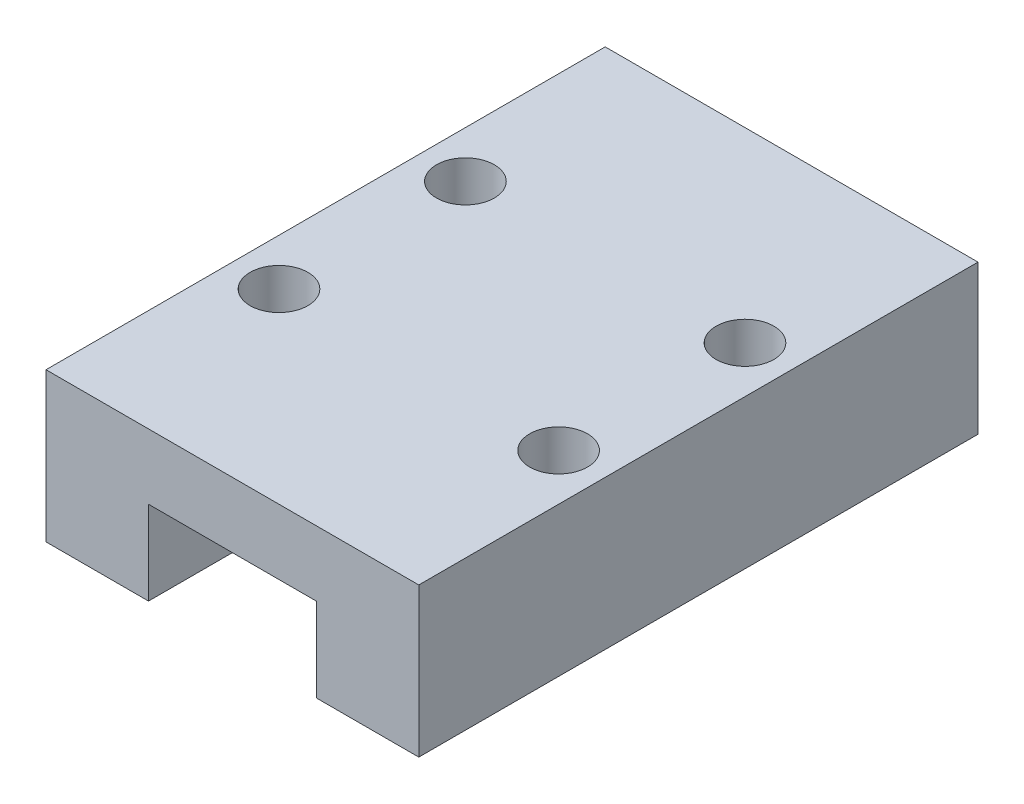
ISO-10303-21;
HEADER;
FILE_DESCRIPTION(('STEP AP214'),'2;1');
FILE_NAME('part.step','',(''),(''),'','','');
FILE_SCHEMA(('AUTOMOTIVE_DESIGN { 1 0 10303 214 1 1 1 1 }'));
ENDSEC;
DATA;
#1=APPLICATION_CONTEXT('core data for automotive mechanical design processes');
#2=APPLICATION_PROTOCOL_DEFINITION('international standard','automotive_design',2000,#1);
#3=PRODUCT_CONTEXT('',#1,'mechanical');
#4=PRODUCT('Part','Part','',(#3));
#5=PRODUCT_RELATED_PRODUCT_CATEGORY('part','',(#4));
#6=PRODUCT_DEFINITION_FORMATION('','',#4);
#7=PRODUCT_DEFINITION_CONTEXT('part definition',#1,'design');
#8=PRODUCT_DEFINITION('design','',#6,#7);
#9=PRODUCT_DEFINITION_SHAPE('','',#8);
#10=(LENGTH_UNIT() NAMED_UNIT(*) SI_UNIT(.MILLI.,.METRE.));
#11=(NAMED_UNIT(*) PLANE_ANGLE_UNIT() SI_UNIT($,.RADIAN.));
#12=(NAMED_UNIT(*) SI_UNIT($,.STERADIAN.) SOLID_ANGLE_UNIT());
#13=UNCERTAINTY_MEASURE_WITH_UNIT(LENGTH_MEASURE(1.E-05),#10,'distance_accuracy_value','');
#14=(GEOMETRIC_REPRESENTATION_CONTEXT(3) GLOBAL_UNCERTAINTY_ASSIGNED_CONTEXT((#13)) GLOBAL_UNIT_ASSIGNED_CONTEXT((#10,
#11,#12)) REPRESENTATION_CONTEXT('',''));
#15=CARTESIAN_POINT('',(0.,0.,0.));
#16=DIRECTION('',(0.,0.,1.));
#17=DIRECTION('',(1.,0.,0.));
#18=AXIS2_PLACEMENT_3D('',#15,#16,#17);
#19=CARTESIAN_POINT('',(0.,0.,0.));
#20=DIRECTION('',(0.,1.,0.));
#21=DIRECTION('',(0.,0.,1.));
#22=AXIS2_PLACEMENT_3D('',#19,#20,#21);
#23=PLANE('',#22);
#24=DIRECTION('',(0.,0.,1.));
#25=VECTOR('',#24,1.);
#26=CARTESIAN_POINT('',(-4.5,0.,-15.));
#27=LINE('',#26,#25);
#28=CARTESIAN_POINT('',(-4.5,0.,-15.));
#29=VERTEX_POINT('',#28);
#30=CARTESIAN_POINT('',(-4.49999999999999,0.,15.));
#31=VERTEX_POINT('',#30);
#32=EDGE_CURVE('E122',#29,#31,#27,.T.);
#33=ORIENTED_EDGE('',*,*,#32,.F.);
#34=DIRECTION('',(-1.,0.,0.));
#35=VECTOR('',#34,1.);
#36=CARTESIAN_POINT('',(-10.,0.,-15.));
#37=LINE('',#36,#35);
#38=CARTESIAN_POINT('',(4.5,0.,-15.));
#39=VERTEX_POINT('',#38);
#40=EDGE_CURVE('E153',#39,#29,#37,.T.);
#41=ORIENTED_EDGE('',*,*,#40,.F.);
#42=DIRECTION('',(0.,0.,-1.));
#43=VECTOR('',#42,1.);
#44=CARTESIAN_POINT('',(4.5,0.,-15.));
#45=LINE('',#44,#43);
#46=CARTESIAN_POINT('',(4.5,0.,15.));
#47=VERTEX_POINT('',#46);
#48=EDGE_CURVE('E134',#47,#39,#45,.T.);
#49=ORIENTED_EDGE('',*,*,#48,.F.);
#50=DIRECTION('',(1.,0.,0.));
#51=VECTOR('',#50,1.);
#52=CARTESIAN_POINT('',(-10.,0.,15.));
#53=LINE('',#52,#51);
#54=EDGE_CURVE('E56',#31,#47,#53,.T.);
#55=ORIENTED_EDGE('',*,*,#54,.F.);
#56=EDGE_LOOP('',(#33,#41,#49,#55));
#57=FACE_BOUND('',#56,.T.);
#58=ADVANCED_FACE('F36',(#57),#23,.F.);
#59=CARTESIAN_POINT('',(10.,3.5,-15.));
#60=DIRECTION('',(-1.,0.,0.));
#61=DIRECTION('',(0.,0.,1.));
#62=AXIS2_PLACEMENT_3D('',#59,#60,#61);
#63=PLANE('',#62);
#64=DIRECTION('',(0.,-1.,0.));
#65=VECTOR('',#64,1.);
#66=CARTESIAN_POINT('',(10.,3.5,15.));
#67=LINE('',#66,#65);
#68=CARTESIAN_POINT('',(10.,3.5,15.));
#69=VERTEX_POINT('',#68);
#70=CARTESIAN_POINT('',(10.,-4.5,15.));
#71=VERTEX_POINT('',#70);
#72=EDGE_CURVE('E162',#69,#71,#67,.T.);
#73=ORIENTED_EDGE('',*,*,#72,.T.);
#74=DIRECTION('',(0.,0.,1.));
#75=VECTOR('',#74,1.);
#76=CARTESIAN_POINT('',(10.,-4.5,-15.));
#77=LINE('',#76,#75);
#78=CARTESIAN_POINT('',(10.,-4.5,-15.));
#79=VERTEX_POINT('',#78);
#80=EDGE_CURVE('E135',#79,#71,#77,.T.);
#81=ORIENTED_EDGE('',*,*,#80,.F.);
#82=DIRECTION('',(0.,-1.,0.));
#83=VECTOR('',#82,1.);
#84=CARTESIAN_POINT('',(10.,3.5,-15.));
#85=LINE('',#84,#83);
#86=CARTESIAN_POINT('',(10.,3.5,-15.));
#87=VERTEX_POINT('',#86);
#88=EDGE_CURVE('E11',#87,#79,#85,.T.);
#89=ORIENTED_EDGE('',*,*,#88,.F.);
#90=DIRECTION('',(0.,0.,-1.));
#91=VECTOR('',#90,1.);
#92=CARTESIAN_POINT('',(10.,3.5,-15.));
#93=LINE('',#92,#91);
#94=EDGE_CURVE('E154',#69,#87,#93,.T.);
#95=ORIENTED_EDGE('',*,*,#94,.F.);
#96=EDGE_LOOP('',(#73,#81,#89,#95));
#97=FACE_BOUND('',#96,.T.);
#98=ADVANCED_FACE('F38',(#97),#63,.F.);
#99=CARTESIAN_POINT('',(-10.,3.5,-15.));
#100=DIRECTION('',(0.,0.,1.));
#101=DIRECTION('',(1.,0.,0.));
#102=AXIS2_PLACEMENT_3D('',#99,#100,#101);
#103=PLANE('',#102);
#104=ORIENTED_EDGE('',*,*,#88,.T.);
#105=DIRECTION('',(1.,0.,0.));
#106=VECTOR('',#105,1.);
#107=CARTESIAN_POINT('',(10.,-4.5,-15.));
#108=LINE('',#107,#106);
#109=CARTESIAN_POINT('',(4.5,-4.5,-15.));
#110=VERTEX_POINT('',#109);
#111=EDGE_CURVE('E142',#110,#79,#108,.T.);
#112=ORIENTED_EDGE('',*,*,#111,.F.);
#113=DIRECTION('',(0.,1.,0.));
#114=VECTOR('',#113,1.);
#115=CARTESIAN_POINT('',(4.5,-4.5,-15.));
#116=LINE('',#115,#114);
#117=EDGE_CURVE('E145',#110,#39,#116,.T.);
#118=ORIENTED_EDGE('',*,*,#117,.T.);
#119=ORIENTED_EDGE('',*,*,#40,.T.);
#120=DIRECTION('',(0.,1.,0.));
#121=VECTOR('',#120,1.);
#122=CARTESIAN_POINT('',(-4.5,-4.5,-15.));
#123=LINE('',#122,#121);
#124=CARTESIAN_POINT('',(-4.5,-4.5,-15.));
#125=VERTEX_POINT('',#124);
#126=EDGE_CURVE('E114',#125,#29,#123,.T.);
#127=ORIENTED_EDGE('',*,*,#126,.F.);
#128=DIRECTION('',(1.,0.,0.));
#129=VECTOR('',#128,1.);
#130=CARTESIAN_POINT('',(-10.,-4.5,-15.));
#131=LINE('',#130,#129);
#132=CARTESIAN_POINT('',(-10.,-4.5,-15.));
#133=VERTEX_POINT('',#132);
#134=EDGE_CURVE('E111',#133,#125,#131,.T.);
#135=ORIENTED_EDGE('',*,*,#134,.F.);
#136=DIRECTION('',(0.,-1.,0.));
#137=VECTOR('',#136,1.);
#138=CARTESIAN_POINT('',(-10.,3.5,-15.));
#139=LINE('',#138,#137);
#140=CARTESIAN_POINT('',(-10.,3.5,-15.));
#141=VERTEX_POINT('',#140);
#142=EDGE_CURVE('E44',#141,#133,#139,.T.);
#143=ORIENTED_EDGE('',*,*,#142,.F.);
#144=DIRECTION('',(-1.,0.,0.));
#145=VECTOR('',#144,1.);
#146=CARTESIAN_POINT('',(-10.,3.5,-15.));
#147=LINE('',#146,#145);
#148=EDGE_CURVE('E157',#87,#141,#147,.T.);
#149=ORIENTED_EDGE('',*,*,#148,.F.);
#150=EDGE_LOOP('',(#104,#112,#118,#119,#127,#135,#143,#149));
#151=FACE_BOUND('',#150,.T.);
#152=ADVANCED_FACE('F112',(#151),#103,.F.);
#153=CARTESIAN_POINT('',(-10.,3.5,-15.));
#154=DIRECTION('',(1.,0.,0.));
#155=DIRECTION('',(0.,0.,-1.));
#156=AXIS2_PLACEMENT_3D('',#153,#154,#155);
#157=PLANE('',#156);
#158=ORIENTED_EDGE('',*,*,#142,.T.);
#159=DIRECTION('',(0.,0.,-1.));
#160=VECTOR('',#159,1.);
#161=CARTESIAN_POINT('',(-10.,-4.5,-15.));
#162=LINE('',#161,#160);
#163=CARTESIAN_POINT('',(-9.99999999999999,-4.5,15.));
#164=VERTEX_POINT('',#163);
#165=EDGE_CURVE('E106',#164,#133,#162,.T.);
#166=ORIENTED_EDGE('',*,*,#165,.F.);
#167=DIRECTION('',(0.,-1.,0.));
#168=VECTOR('',#167,1.);
#169=CARTESIAN_POINT('',(-10.,3.5,15.));
#170=LINE('',#169,#168);
#171=CARTESIAN_POINT('',(-10.,3.5,15.));
#172=VERTEX_POINT('',#171);
#173=EDGE_CURVE('E109',#172,#164,#170,.T.);
#174=ORIENTED_EDGE('',*,*,#173,.F.);
#175=DIRECTION('',(0.,0.,1.));
#176=VECTOR('',#175,1.);
#177=CARTESIAN_POINT('',(-10.,3.5,-15.));
#178=LINE('',#177,#176);
#179=EDGE_CURVE('E107',#141,#172,#178,.T.);
#180=ORIENTED_EDGE('',*,*,#179,.F.);
#181=EDGE_LOOP('',(#158,#166,#174,#180));
#182=FACE_BOUND('',#181,.T.);
#183=ADVANCED_FACE('F103',(#182),#157,.F.);
#184=CARTESIAN_POINT('',(-10.,3.5,15.));
#185=DIRECTION('',(0.,0.,-1.));
#186=DIRECTION('',(-1.,0.,0.));
#187=AXIS2_PLACEMENT_3D('',#184,#185,#186);
#188=PLANE('',#187);
#189=ORIENTED_EDGE('',*,*,#173,.T.);
#190=DIRECTION('',(-1.,0.,0.));
#191=VECTOR('',#190,1.);
#192=CARTESIAN_POINT('',(-9.99999999999999,-4.5,15.));
#193=LINE('',#192,#191);
#194=CARTESIAN_POINT('',(-4.49999999999999,-4.5,15.));
#195=VERTEX_POINT('',#194);
#196=EDGE_CURVE('E121',#195,#164,#193,.T.);
#197=ORIENTED_EDGE('',*,*,#196,.F.);
#198=DIRECTION('',(0.,1.,0.));
#199=VECTOR('',#198,1.);
#200=CARTESIAN_POINT('',(-4.49999999999999,-4.5,15.));
#201=LINE('',#200,#199);
#202=EDGE_CURVE('E51',#195,#31,#201,.T.);
#203=ORIENTED_EDGE('',*,*,#202,.T.);
#204=ORIENTED_EDGE('',*,*,#54,.T.);
#205=DIRECTION('',(0.,1.,0.));
#206=VECTOR('',#205,1.);
#207=CARTESIAN_POINT('',(4.5,-4.5,15.));
#208=LINE('',#207,#206);
#209=CARTESIAN_POINT('',(4.5,-4.5,15.));
#210=VERTEX_POINT('',#209);
#211=EDGE_CURVE('E150',#210,#47,#208,.T.);
#212=ORIENTED_EDGE('',*,*,#211,.F.);
#213=DIRECTION('',(-1.,0.,0.));
#214=VECTOR('',#213,1.);
#215=CARTESIAN_POINT('',(10.,-4.5,15.));
#216=LINE('',#215,#214);
#217=EDGE_CURVE('E138',#71,#210,#216,.T.);
#218=ORIENTED_EDGE('',*,*,#217,.F.);
#219=ORIENTED_EDGE('',*,*,#72,.F.);
#220=DIRECTION('',(1.,0.,0.));
#221=VECTOR('',#220,1.);
#222=CARTESIAN_POINT('',(-10.,3.5,15.));
#223=LINE('',#222,#221);
#224=EDGE_CURVE('E160',#172,#69,#223,.T.);
#225=ORIENTED_EDGE('',*,*,#224,.F.);
#226=EDGE_LOOP('',(#189,#197,#203,#204,#212,#218,#219,#225));
#227=FACE_BOUND('',#226,.T.);
#228=ADVANCED_FACE('F167',(#227),#188,.F.);
#229=CARTESIAN_POINT('',(0.,3.5,0.));
#230=DIRECTION('',(0.,1.,0.));
#231=DIRECTION('',(0.,0.,1.));
#232=AXIS2_PLACEMENT_3D('',#229,#230,#231);
#233=PLANE('',#232);
#234=CARTESIAN_POINT('',(7.5,3.5,5.));
#235=DIRECTION('',(0.,1.,0.));
#236=DIRECTION('',(0.,0.,1.));
#237=AXIS2_PLACEMENT_3D('',#234,#235,#236);
#238=CIRCLE('',#237,1.55);
#239=CARTESIAN_POINT('',(7.5,3.5,6.55));
#240=VERTEX_POINT('',#239);
#241=EDGE_CURVE('E293',#240,#240,#238,.T.);
#242=ORIENTED_EDGE('',*,*,#241,.F.);
#243=EDGE_LOOP('',(#242));
#244=FACE_BOUND('',#243,.T.);
#245=CARTESIAN_POINT('',(7.5,3.5,-5.));
#246=DIRECTION('',(0.,1.,0.));
#247=DIRECTION('',(0.,0.,1.));
#248=AXIS2_PLACEMENT_3D('',#245,#246,#247);
#249=CIRCLE('',#248,1.55);
#250=CARTESIAN_POINT('',(7.5,3.5,-3.45));
#251=VERTEX_POINT('',#250);
#252=EDGE_CURVE('E295',#251,#251,#249,.T.);
#253=ORIENTED_EDGE('',*,*,#252,.F.);
#254=EDGE_LOOP('',(#253));
#255=FACE_BOUND('',#254,.T.);
#256=CARTESIAN_POINT('',(-7.5,3.5,-5.));
#257=DIRECTION('',(0.,1.,0.));
#258=DIRECTION('',(0.,0.,1.));
#259=AXIS2_PLACEMENT_3D('',#256,#257,#258);
#260=CIRCLE('',#259,1.55);
#261=CARTESIAN_POINT('',(-7.5,3.5,-3.45));
#262=VERTEX_POINT('',#261);
#263=EDGE_CURVE('E306',#262,#262,#260,.T.);
#264=ORIENTED_EDGE('',*,*,#263,.F.);
#265=EDGE_LOOP('',(#264));
#266=FACE_BOUND('',#265,.T.);
#267=CARTESIAN_POINT('',(-7.5,3.5,5.));
#268=DIRECTION('',(0.,1.,0.));
#269=DIRECTION('',(0.,0.,1.));
#270=AXIS2_PLACEMENT_3D('',#267,#268,#269);
#271=CIRCLE('',#270,1.55);
#272=CARTESIAN_POINT('',(-7.5,3.5,6.55));
#273=VERTEX_POINT('',#272);
#274=EDGE_CURVE('E127',#273,#273,#271,.T.);
#275=ORIENTED_EDGE('',*,*,#274,.F.);
#276=EDGE_LOOP('',(#275));
#277=FACE_BOUND('',#276,.T.);
#278=ORIENTED_EDGE('',*,*,#94,.T.);
#279=ORIENTED_EDGE('',*,*,#148,.T.);
#280=ORIENTED_EDGE('',*,*,#179,.T.);
#281=ORIENTED_EDGE('',*,*,#224,.T.);
#282=EDGE_LOOP('',(#278,#279,#280,#281));
#283=FACE_BOUND('',#282,.T.);
#284=ADVANCED_FACE('F172',(#244,#255,#266,#277,#283),#233,.T.);
#285=CARTESIAN_POINT('',(4.5,-4.5,-15.));
#286=DIRECTION('',(1.,0.,0.));
#287=DIRECTION('',(0.,0.,-1.));
#288=AXIS2_PLACEMENT_3D('',#285,#286,#287);
#289=PLANE('',#288);
#290=ORIENTED_EDGE('',*,*,#48,.T.);
#291=ORIENTED_EDGE('',*,*,#117,.F.);
#292=DIRECTION('',(0.,0.,-1.));
#293=VECTOR('',#292,1.);
#294=CARTESIAN_POINT('',(4.5,-4.5,-15.));
#295=LINE('',#294,#293);
#296=EDGE_CURVE('E140',#210,#110,#295,.T.);
#297=ORIENTED_EDGE('',*,*,#296,.F.);
#298=ORIENTED_EDGE('',*,*,#211,.T.);
#299=EDGE_LOOP('',(#290,#291,#297,#298));
#300=FACE_BOUND('',#299,.T.);
#301=ADVANCED_FACE('F182',(#300),#289,.F.);
#302=CARTESIAN_POINT('',(0.,-4.5,0.));
#303=DIRECTION('',(0.,-1.,0.));
#304=DIRECTION('',(0.,0.,-1.));
#305=AXIS2_PLACEMENT_3D('',#302,#303,#304);
#306=PLANE('',#305);
#307=CARTESIAN_POINT('',(7.5,-4.5,5.));
#308=DIRECTION('',(0.,1.,0.));
#309=DIRECTION('',(0.,0.,1.));
#310=AXIS2_PLACEMENT_3D('',#307,#308,#309);
#311=CIRCLE('',#310,1.55);
#312=CARTESIAN_POINT('',(7.5,-4.5,6.55));
#313=VERTEX_POINT('',#312);
#314=EDGE_CURVE('E290',#313,#313,#311,.T.);
#315=ORIENTED_EDGE('',*,*,#314,.T.);
#316=EDGE_LOOP('',(#315));
#317=FACE_BOUND('',#316,.T.);
#318=CARTESIAN_POINT('',(7.5,-4.5,-5.));
#319=DIRECTION('',(0.,1.,0.));
#320=DIRECTION('',(0.,0.,1.));
#321=AXIS2_PLACEMENT_3D('',#318,#319,#320);
#322=CIRCLE('',#321,1.55);
#323=CARTESIAN_POINT('',(7.5,-4.5,-3.45));
#324=VERTEX_POINT('',#323);
#325=EDGE_CURVE('E310',#324,#324,#322,.T.);
#326=ORIENTED_EDGE('',*,*,#325,.T.);
#327=EDGE_LOOP('',(#326));
#328=FACE_BOUND('',#327,.T.);
#329=ORIENTED_EDGE('',*,*,#80,.T.);
#330=ORIENTED_EDGE('',*,*,#217,.T.);
#331=ORIENTED_EDGE('',*,*,#296,.T.);
#332=ORIENTED_EDGE('',*,*,#111,.T.);
#333=EDGE_LOOP('',(#329,#330,#331,#332));
#334=FACE_BOUND('',#333,.T.);
#335=ADVANCED_FACE('F178',(#317,#328,#334),#306,.T.);
#336=CARTESIAN_POINT('',(-4.5,-4.5,-15.));
#337=DIRECTION('',(-1.,0.,0.));
#338=DIRECTION('',(0.,0.,1.));
#339=AXIS2_PLACEMENT_3D('',#336,#337,#338);
#340=PLANE('',#339);
#341=ORIENTED_EDGE('',*,*,#32,.T.);
#342=ORIENTED_EDGE('',*,*,#202,.F.);
#343=DIRECTION('',(0.,0.,1.));
#344=VECTOR('',#343,1.);
#345=CARTESIAN_POINT('',(-4.5,-4.5,-15.));
#346=LINE('',#345,#344);
#347=EDGE_CURVE('E117',#125,#195,#346,.T.);
#348=ORIENTED_EDGE('',*,*,#347,.F.);
#349=ORIENTED_EDGE('',*,*,#126,.T.);
#350=EDGE_LOOP('',(#341,#342,#348,#349));
#351=FACE_BOUND('',#350,.T.);
#352=ADVANCED_FACE('F186',(#351),#340,.F.);
#353=CARTESIAN_POINT('',(0.,-4.5,0.));
#354=DIRECTION('',(0.,1.,0.));
#355=DIRECTION('',(0.,0.,1.));
#356=AXIS2_PLACEMENT_3D('',#353,#354,#355);
#357=PLANE('',#356);
#358=CARTESIAN_POINT('',(-7.5,-4.5,-5.));
#359=DIRECTION('',(0.,1.,0.));
#360=DIRECTION('',(0.,0.,1.));
#361=AXIS2_PLACEMENT_3D('',#358,#359,#360);
#362=CIRCLE('',#361,1.55);
#363=CARTESIAN_POINT('',(-7.5,-4.5,-3.45));
#364=VERTEX_POINT('',#363);
#365=EDGE_CURVE('E302',#364,#364,#362,.T.);
#366=ORIENTED_EDGE('',*,*,#365,.T.);
#367=EDGE_LOOP('',(#366));
#368=FACE_BOUND('',#367,.T.);
#369=CARTESIAN_POINT('',(-7.5,-4.5,5.));
#370=DIRECTION('',(0.,1.,0.));
#371=DIRECTION('',(0.,0.,1.));
#372=AXIS2_PLACEMENT_3D('',#369,#370,#371);
#373=CIRCLE('',#372,1.55);
#374=CARTESIAN_POINT('',(-7.5,-4.5,6.55));
#375=VERTEX_POINT('',#374);
#376=EDGE_CURVE('E124',#375,#375,#373,.T.);
#377=ORIENTED_EDGE('',*,*,#376,.T.);
#378=EDGE_LOOP('',(#377));
#379=FACE_BOUND('',#378,.T.);
#380=ORIENTED_EDGE('',*,*,#165,.T.);
#381=ORIENTED_EDGE('',*,*,#134,.T.);
#382=ORIENTED_EDGE('',*,*,#347,.T.);
#383=ORIENTED_EDGE('',*,*,#196,.T.);
#384=EDGE_LOOP('',(#380,#381,#382,#383));
#385=FACE_BOUND('',#384,.T.);
#386=ADVANCED_FACE('F120',(#368,#379,#385),#357,.F.);
#387=CARTESIAN_POINT('',(-7.5,-4.5,5.));
#388=DIRECTION('',(0.,1.,0.));
#389=DIRECTION('',(0.,0.,1.));
#390=AXIS2_PLACEMENT_3D('',#387,#388,#389);
#391=CYLINDRICAL_SURFACE('',#390,1.55);
#392=ORIENTED_EDGE('',*,*,#376,.F.);
#393=EDGE_LOOP('',(#392));
#394=FACE_BOUND('',#393,.T.);
#395=ORIENTED_EDGE('',*,*,#274,.T.);
#396=EDGE_LOOP('',(#395));
#397=FACE_BOUND('',#396,.T.);
#398=ADVANCED_FACE('F193',(#394,#397),#391,.F.);
#399=CARTESIAN_POINT('',(-7.5,-4.5,-5.));
#400=DIRECTION('',(0.,1.,0.));
#401=DIRECTION('',(0.,0.,1.));
#402=AXIS2_PLACEMENT_3D('',#399,#400,#401);
#403=CYLINDRICAL_SURFACE('',#402,1.55);
#404=ORIENTED_EDGE('',*,*,#365,.F.);
#405=EDGE_LOOP('',(#404));
#406=FACE_BOUND('',#405,.T.);
#407=ORIENTED_EDGE('',*,*,#263,.T.);
#408=EDGE_LOOP('',(#407));
#409=FACE_BOUND('',#408,.T.);
#410=ADVANCED_FACE('F253',(#406,#409),#403,.F.);
#411=CARTESIAN_POINT('',(7.5,-4.5,-5.));
#412=DIRECTION('',(0.,1.,0.));
#413=DIRECTION('',(0.,0.,1.));
#414=AXIS2_PLACEMENT_3D('',#411,#412,#413);
#415=CYLINDRICAL_SURFACE('',#414,1.55);
#416=ORIENTED_EDGE('',*,*,#325,.F.);
#417=EDGE_LOOP('',(#416));
#418=FACE_BOUND('',#417,.T.);
#419=ORIENTED_EDGE('',*,*,#252,.T.);
#420=EDGE_LOOP('',(#419));
#421=FACE_BOUND('',#420,.T.);
#422=ADVANCED_FACE('F263',(#418,#421),#415,.F.);
#423=CARTESIAN_POINT('',(7.5,-4.5,5.));
#424=DIRECTION('',(0.,1.,0.));
#425=DIRECTION('',(0.,0.,1.));
#426=AXIS2_PLACEMENT_3D('',#423,#424,#425);
#427=CYLINDRICAL_SURFACE('',#426,1.55);
#428=ORIENTED_EDGE('',*,*,#314,.F.);
#429=EDGE_LOOP('',(#428));
#430=FACE_BOUND('',#429,.T.);
#431=ORIENTED_EDGE('',*,*,#241,.T.);
#432=EDGE_LOOP('',(#431));
#433=FACE_BOUND('',#432,.T.);
#434=ADVANCED_FACE('F273',(#430,#433),#427,.F.);
#435=CLOSED_SHELL('',(#58,#98,#152,#183,#228,#284,#301,#335,#352,#386,#398,#410,#422,#434));
#436=MANIFOLD_SOLID_BREP('B2',#435);
#437=ADVANCED_BREP_SHAPE_REPRESENTATION('',(#18,#436),#14);
#438=SHAPE_DEFINITION_REPRESENTATION(#9,#437);
ENDSEC;
END-ISO-10303-21;
